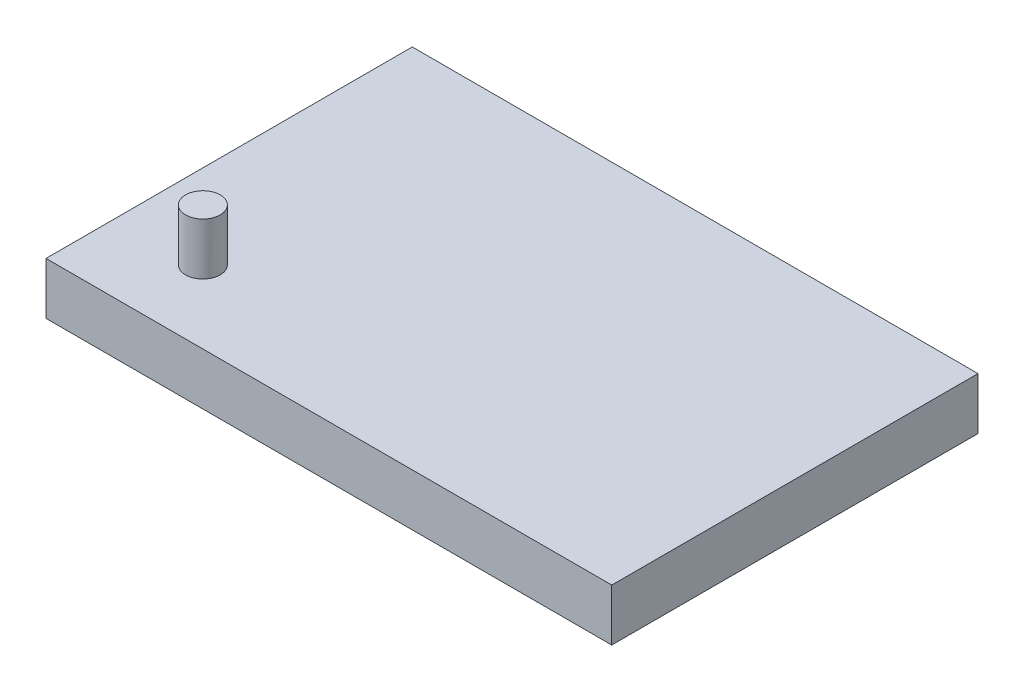
ISO-10303-21;
HEADER;
FILE_DESCRIPTION(('STEP AP214'),'2;1');
FILE_NAME('part.step','',(''),(''),'','','');
FILE_SCHEMA(('AUTOMOTIVE_DESIGN { 1 0 10303 214 1 1 1 1 }'));
ENDSEC;
DATA;
#1=APPLICATION_CONTEXT('core data for automotive mechanical design processes');
#2=APPLICATION_PROTOCOL_DEFINITION('international standard','automotive_design',2000,#1);
#3=PRODUCT_CONTEXT('',#1,'mechanical');
#4=PRODUCT('Part','Part','',(#3));
#5=PRODUCT_RELATED_PRODUCT_CATEGORY('part','',(#4));
#6=PRODUCT_DEFINITION_FORMATION('','',#4);
#7=PRODUCT_DEFINITION_CONTEXT('part definition',#1,'design');
#8=PRODUCT_DEFINITION('design','',#6,#7);
#9=PRODUCT_DEFINITION_SHAPE('','',#8);
#10=(LENGTH_UNIT() NAMED_UNIT(*) SI_UNIT(.MILLI.,.METRE.));
#11=(NAMED_UNIT(*) PLANE_ANGLE_UNIT() SI_UNIT($,.RADIAN.));
#12=(NAMED_UNIT(*) SI_UNIT($,.STERADIAN.) SOLID_ANGLE_UNIT());
#13=UNCERTAINTY_MEASURE_WITH_UNIT(LENGTH_MEASURE(1.E-05),#10,'distance_accuracy_value','');
#14=(GEOMETRIC_REPRESENTATION_CONTEXT(3) GLOBAL_UNCERTAINTY_ASSIGNED_CONTEXT((#13)) GLOBAL_UNIT_ASSIGNED_CONTEXT((#10,
#11,#12)) REPRESENTATION_CONTEXT('',''));
#15=CARTESIAN_POINT('',(0.,0.,0.));
#16=DIRECTION('',(0.,0.,1.));
#17=DIRECTION('',(1.,0.,0.));
#18=AXIS2_PLACEMENT_3D('',#15,#16,#17);
#19=CARTESIAN_POINT('',(81.6250916467887,15.,52.843109704171));
#20=DIRECTION('',(-1.,0.,0.));
#21=DIRECTION('',(0.,0.,1.));
#22=AXIS2_PLACEMENT_3D('',#19,#20,#21);
#23=PLANE('',#22);
#24=DIRECTION('',(0.,0.,-1.));
#25=VECTOR('',#24,1.);
#26=CARTESIAN_POINT('',(81.6250916467887,0.,52.843109704171));
#27=LINE('',#26,#25);
#28=CARTESIAN_POINT('',(81.6250916467887,0.,52.843109704171));
#29=VERTEX_POINT('',#28);
#30=CARTESIAN_POINT('',(81.6250916467887,0.,-52.843109704171));
#31=VERTEX_POINT('',#30);
#32=EDGE_CURVE('E99',#29,#31,#27,.T.);
#33=ORIENTED_EDGE('',*,*,#32,.T.);
#34=DIRECTION('',(0.,-1.,0.));
#35=VECTOR('',#34,1.);
#36=CARTESIAN_POINT('',(81.6250916467887,15.,-52.843109704171));
#37=LINE('',#36,#35);
#38=CARTESIAN_POINT('',(81.6250916467887,15.,-52.843109704171));
#39=VERTEX_POINT('',#38);
#40=EDGE_CURVE('E41',#39,#31,#37,.T.);
#41=ORIENTED_EDGE('',*,*,#40,.F.);
#42=DIRECTION('',(0.,0.,-1.));
#43=VECTOR('',#42,1.);
#44=CARTESIAN_POINT('',(81.6250916467887,15.,52.843109704171));
#45=LINE('',#44,#43);
#46=CARTESIAN_POINT('',(81.6250916467887,15.,52.843109704171));
#47=VERTEX_POINT('',#46);
#48=EDGE_CURVE('E85',#47,#39,#45,.T.);
#49=ORIENTED_EDGE('',*,*,#48,.F.);
#50=DIRECTION('',(0.,-1.,0.));
#51=VECTOR('',#50,1.);
#52=CARTESIAN_POINT('',(81.6250916467887,15.,52.843109704171));
#53=LINE('',#52,#51);
#54=EDGE_CURVE('E95',#47,#29,#53,.T.);
#55=ORIENTED_EDGE('',*,*,#54,.T.);
#56=EDGE_LOOP('',(#33,#41,#49,#55));
#57=FACE_BOUND('',#56,.T.);
#58=ADVANCED_FACE('F33',(#57),#23,.F.);
#59=CARTESIAN_POINT('',(-81.6250916467887,15.,-52.843109704171));
#60=DIRECTION('',(0.,0.,1.));
#61=DIRECTION('',(1.,0.,0.));
#62=AXIS2_PLACEMENT_3D('',#59,#60,#61);
#63=PLANE('',#62);
#64=DIRECTION('',(-1.,0.,0.));
#65=VECTOR('',#64,1.);
#66=CARTESIAN_POINT('',(-81.6250916467887,0.,-52.843109704171));
#67=LINE('',#66,#65);
#68=CARTESIAN_POINT('',(-81.6250916467887,0.,-52.843109704171));
#69=VERTEX_POINT('',#68);
#70=EDGE_CURVE('E90',#31,#69,#67,.T.);
#71=ORIENTED_EDGE('',*,*,#70,.T.);
#72=DIRECTION('',(0.,-1.,0.));
#73=VECTOR('',#72,1.);
#74=CARTESIAN_POINT('',(-81.6250916467887,15.,-52.843109704171));
#75=LINE('',#74,#73);
#76=CARTESIAN_POINT('',(-81.6250916467887,15.,-52.843109704171));
#77=VERTEX_POINT('',#76);
#78=EDGE_CURVE('E88',#77,#69,#75,.T.);
#79=ORIENTED_EDGE('',*,*,#78,.F.);
#80=DIRECTION('',(-1.,0.,0.));
#81=VECTOR('',#80,1.);
#82=CARTESIAN_POINT('',(-81.6250916467887,15.,-52.843109704171));
#83=LINE('',#82,#81);
#84=EDGE_CURVE('E80',#39,#77,#83,.T.);
#85=ORIENTED_EDGE('',*,*,#84,.F.);
#86=ORIENTED_EDGE('',*,*,#40,.T.);
#87=EDGE_LOOP('',(#71,#79,#85,#86));
#88=FACE_BOUND('',#87,.T.);
#89=ADVANCED_FACE('F89',(#88),#63,.F.);
#90=CARTESIAN_POINT('',(-81.6250916467887,15.,52.843109704171));
#91=DIRECTION('',(1.,0.,0.));
#92=DIRECTION('',(0.,0.,-1.));
#93=AXIS2_PLACEMENT_3D('',#90,#91,#92);
#94=PLANE('',#93);
#95=DIRECTION('',(0.,0.,1.));
#96=VECTOR('',#95,1.);
#97=CARTESIAN_POINT('',(-81.6250916467887,0.,52.843109704171));
#98=LINE('',#97,#96);
#99=CARTESIAN_POINT('',(-81.6250916467887,0.,52.843109704171));
#100=VERTEX_POINT('',#99);
#101=EDGE_CURVE('E66',#69,#100,#98,.T.);
#102=ORIENTED_EDGE('',*,*,#101,.T.);
#103=DIRECTION('',(0.,-1.,0.));
#104=VECTOR('',#103,1.);
#105=CARTESIAN_POINT('',(-81.6250916467887,15.,52.843109704171));
#106=LINE('',#105,#104);
#107=CARTESIAN_POINT('',(-81.6250916467887,15.,52.843109704171));
#108=VERTEX_POINT('',#107);
#109=EDGE_CURVE('E91',#108,#100,#106,.T.);
#110=ORIENTED_EDGE('',*,*,#109,.F.);
#111=DIRECTION('',(0.,0.,1.));
#112=VECTOR('',#111,1.);
#113=CARTESIAN_POINT('',(-81.6250916467887,15.,52.843109704171));
#114=LINE('',#113,#112);
#115=EDGE_CURVE('E83',#77,#108,#114,.T.);
#116=ORIENTED_EDGE('',*,*,#115,.F.);
#117=ORIENTED_EDGE('',*,*,#78,.T.);
#118=EDGE_LOOP('',(#102,#110,#116,#117));
#119=FACE_BOUND('',#118,.T.);
#120=ADVANCED_FACE('F93',(#119),#94,.F.);
#121=CARTESIAN_POINT('',(-81.6250916467887,15.,52.843109704171));
#122=DIRECTION('',(0.,0.,-1.));
#123=DIRECTION('',(-1.,0.,0.));
#124=AXIS2_PLACEMENT_3D('',#121,#122,#123);
#125=PLANE('',#124);
#126=DIRECTION('',(1.,0.,0.));
#127=VECTOR('',#126,1.);
#128=CARTESIAN_POINT('',(-81.6250916467887,0.,52.843109704171));
#129=LINE('',#128,#127);
#130=EDGE_CURVE('E72',#100,#29,#129,.T.);
#131=ORIENTED_EDGE('',*,*,#130,.T.);
#132=ORIENTED_EDGE('',*,*,#54,.F.);
#133=DIRECTION('',(1.,0.,0.));
#134=VECTOR('',#133,1.);
#135=CARTESIAN_POINT('',(-81.6250916467887,15.,52.843109704171));
#136=LINE('',#135,#134);
#137=EDGE_CURVE('E49',#108,#47,#136,.T.);
#138=ORIENTED_EDGE('',*,*,#137,.F.);
#139=ORIENTED_EDGE('',*,*,#109,.T.);
#140=EDGE_LOOP('',(#131,#132,#138,#139));
#141=FACE_BOUND('',#140,.T.);
#142=ADVANCED_FACE('F121',(#141),#125,.F.);
#143=CARTESIAN_POINT('',(0.,15.,0.));
#144=DIRECTION('',(0.,-1.,0.));
#145=DIRECTION('',(0.,0.,-1.));
#146=AXIS2_PLACEMENT_3D('',#143,#144,#145);
#147=PLANE('',#146);
#148=CARTESIAN_POINT('',(-57.3686569376548,15.,31.8330150376482));
#149=DIRECTION('',(0.,-1.,0.));
#150=DIRECTION('',(0.,0.,-1.));
#151=AXIS2_PLACEMENT_3D('',#148,#149,#150);
#152=CIRCLE('',#151,5.);
#153=CARTESIAN_POINT('',(-57.3686569376548,15.,26.8330150376482));
#154=VERTEX_POINT('',#153);
#155=EDGE_CURVE('E11',#154,#154,#152,.F.);
#156=ORIENTED_EDGE('',*,*,#155,.F.);
#157=EDGE_LOOP('',(#156));
#158=FACE_BOUND('',#157,.T.);
#159=ORIENTED_EDGE('',*,*,#48,.T.);
#160=ORIENTED_EDGE('',*,*,#84,.T.);
#161=ORIENTED_EDGE('',*,*,#115,.T.);
#162=ORIENTED_EDGE('',*,*,#137,.T.);
#163=EDGE_LOOP('',(#159,#160,#161,#162));
#164=FACE_BOUND('',#163,.T.);
#165=ADVANCED_FACE('F81',(#158,#164),#147,.F.);
#166=CARTESIAN_POINT('',(0.,0.,0.));
#167=DIRECTION('',(0.,-1.,0.));
#168=DIRECTION('',(0.,0.,-1.));
#169=AXIS2_PLACEMENT_3D('',#166,#167,#168);
#170=PLANE('',#169);
#171=ORIENTED_EDGE('',*,*,#32,.F.);
#172=ORIENTED_EDGE('',*,*,#130,.F.);
#173=ORIENTED_EDGE('',*,*,#101,.F.);
#174=ORIENTED_EDGE('',*,*,#70,.F.);
#175=EDGE_LOOP('',(#171,#172,#173,#174));
#176=FACE_BOUND('',#175,.T.);
#177=ADVANCED_FACE('F110',(#176),#170,.T.);
#178=CARTESIAN_POINT('',(-57.3686569376548,30.,31.8330150376482));
#179=DIRECTION('',(0.,-1.,0.));
#180=DIRECTION('',(0.,0.,-1.));
#181=AXIS2_PLACEMENT_3D('',#178,#179,#180);
#182=CYLINDRICAL_SURFACE('',#181,5.);
#183=CARTESIAN_POINT('',(-57.3686569376548,30.,31.8330150376482));
#184=DIRECTION('',(0.,1.,0.));
#185=DIRECTION('',(0.,0.,1.));
#186=AXIS2_PLACEMENT_3D('',#183,#184,#185);
#187=CIRCLE('',#186,5.);
#188=CARTESIAN_POINT('',(-57.3686569376548,30.,36.8330150376482));
#189=VERTEX_POINT('',#188);
#190=EDGE_CURVE('E102',#189,#189,#187,.T.);
#191=ORIENTED_EDGE('',*,*,#190,.F.);
#192=EDGE_LOOP('',(#191));
#193=FACE_BOUND('',#192,.T.);
#194=ORIENTED_EDGE('',*,*,#155,.T.);
#195=EDGE_LOOP('',(#194));
#196=FACE_BOUND('',#195,.T.);
#197=ADVANCED_FACE('F112',(#193,#196),#182,.T.);
#198=CARTESIAN_POINT('',(-57.3686569376548,30.,31.8330150376482));
#199=DIRECTION('',(0.,1.,0.));
#200=DIRECTION('',(0.,0.,1.));
#201=AXIS2_PLACEMENT_3D('',#198,#199,#200);
#202=PLANE('',#201);
#203=ORIENTED_EDGE('',*,*,#190,.T.);
#204=EDGE_LOOP('',(#203));
#205=FACE_BOUND('',#204,.T.);
#206=ADVANCED_FACE('F118',(#205),#202,.T.);
#207=CLOSED_SHELL('',(#58,#89,#120,#142,#165,#177,#197,#206));
#208=MANIFOLD_SOLID_BREP('B2',#207);
#209=ADVANCED_BREP_SHAPE_REPRESENTATION('',(#18,#208),#14);
#210=SHAPE_DEFINITION_REPRESENTATION(#9,#209);
ENDSEC;
END-ISO-10303-21;
